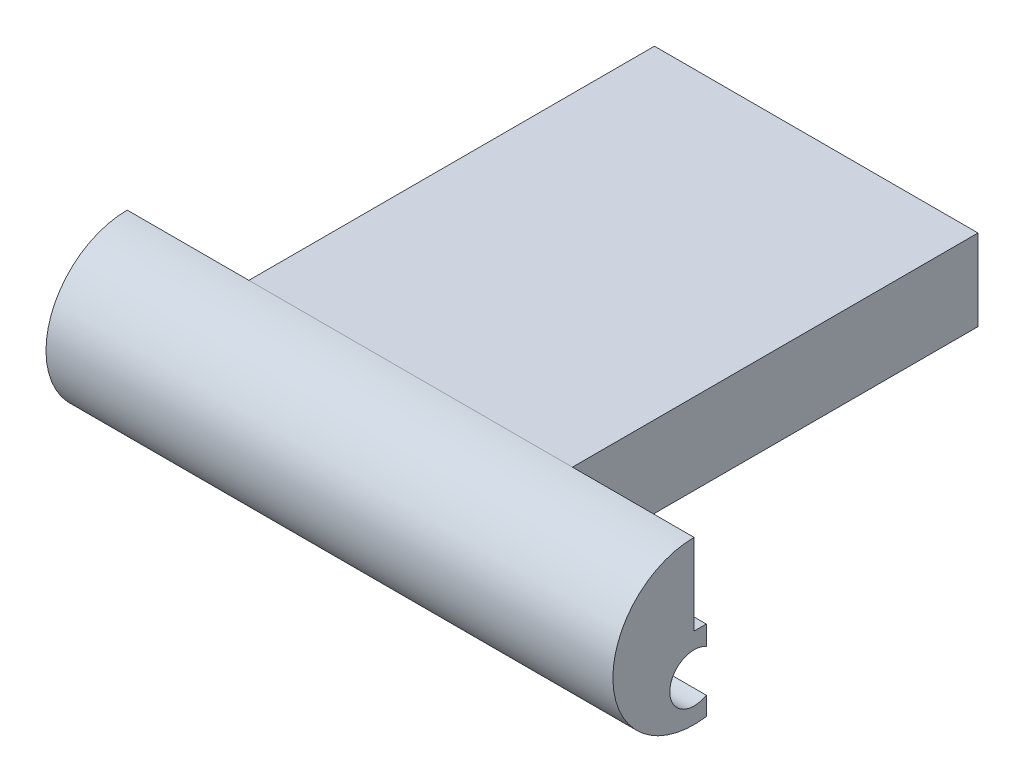
ISO-10303-21;
HEADER;
FILE_DESCRIPTION(('STEP AP214'),'2;1');
FILE_NAME('part.step','',(''),(''),'','','');
FILE_SCHEMA(('AUTOMOTIVE_DESIGN { 1 0 10303 214 1 1 1 1 }'));
ENDSEC;
DATA;
#1=APPLICATION_CONTEXT('core data for automotive mechanical design processes');
#2=APPLICATION_PROTOCOL_DEFINITION('international standard','automotive_design',2000,#1);
#3=PRODUCT_CONTEXT('',#1,'mechanical');
#4=PRODUCT('Part','Part','',(#3));
#5=PRODUCT_RELATED_PRODUCT_CATEGORY('part','',(#4));
#6=PRODUCT_DEFINITION_FORMATION('','',#4);
#7=PRODUCT_DEFINITION_CONTEXT('part definition',#1,'design');
#8=PRODUCT_DEFINITION('design','',#6,#7);
#9=PRODUCT_DEFINITION_SHAPE('','',#8);
#10=(LENGTH_UNIT() NAMED_UNIT(*) SI_UNIT(.MILLI.,.METRE.));
#11=(NAMED_UNIT(*) PLANE_ANGLE_UNIT() SI_UNIT($,.RADIAN.));
#12=(NAMED_UNIT(*) SI_UNIT($,.STERADIAN.) SOLID_ANGLE_UNIT());
#13=UNCERTAINTY_MEASURE_WITH_UNIT(LENGTH_MEASURE(1.E-05),#10,'distance_accuracy_value','');
#14=(GEOMETRIC_REPRESENTATION_CONTEXT(3) GLOBAL_UNCERTAINTY_ASSIGNED_CONTEXT((#13)) GLOBAL_UNIT_ASSIGNED_CONTEXT((#10,
#11,#12)) REPRESENTATION_CONTEXT('',''));
#15=CARTESIAN_POINT('',(0.,0.,0.));
#16=DIRECTION('',(0.,0.,1.));
#17=DIRECTION('',(1.,0.,0.));
#18=AXIS2_PLACEMENT_3D('',#15,#16,#17);
#19=CARTESIAN_POINT('',(-223.899622641509,176.581886792453,500.));
#20=DIRECTION('',(1.,0.,0.));
#21=DIRECTION('',(0.,0.,-1.));
#22=AXIS2_PLACEMENT_3D('',#19,#20,#21);
#23=PLANE('',#22);
#24=DIRECTION('',(0.,-1.,0.));
#25=VECTOR('',#24,1.);
#26=CARTESIAN_POINT('',(-223.899622641509,176.581886792453,0.));
#27=LINE('',#26,#25);
#28=CARTESIAN_POINT('',(-223.899622641509,276.581886792453,0.));
#29=VERTEX_POINT('',#28);
#30=CARTESIAN_POINT('',(-223.899622641509,176.581886792453,0.));
#31=VERTEX_POINT('',#30);
#32=EDGE_CURVE('E177',#29,#31,#27,.T.);
#33=ORIENTED_EDGE('',*,*,#32,.T.);
#34=DIRECTION('',(0.,0.,-1.));
#35=VECTOR('',#34,1.);
#36=CARTESIAN_POINT('',(-223.899622641509,176.581886792453,500.));
#37=LINE('',#36,#35);
#38=CARTESIAN_POINT('',(-223.899622641509,176.581886792453,485.));
#39=VERTEX_POINT('',#38);
#40=EDGE_CURVE('E46',#39,#31,#37,.T.);
#41=ORIENTED_EDGE('',*,*,#40,.F.);
#42=CARTESIAN_POINT('',(-223.899622641509,176.581886792453,500.));
#43=VERTEX_POINT('',#42);
#44=EDGE_CURVE('E11',#43,#39,#37,.T.);
#45=ORIENTED_EDGE('',*,*,#44,.F.);
#46=DIRECTION('',(0.,-1.,0.));
#47=VECTOR('',#46,1.);
#48=CARTESIAN_POINT('',(-223.899622641509,176.581886792453,500.));
#49=LINE('',#48,#47);
#50=CARTESIAN_POINT('',(-223.899622641509,276.581886792453,500.));
#51=VERTEX_POINT('',#50);
#52=EDGE_CURVE('E188',#51,#43,#49,.T.);
#53=ORIENTED_EDGE('',*,*,#52,.F.);
#54=DIRECTION('',(0.,0.,-1.));
#55=VECTOR('',#54,1.);
#56=CARTESIAN_POINT('',(-223.899622641509,276.581886792453,500.));
#57=LINE('',#56,#55);
#58=EDGE_CURVE('E195',#51,#29,#57,.T.);
#59=ORIENTED_EDGE('',*,*,#58,.T.);
#60=EDGE_LOOP('',(#33,#41,#45,#53,#59));
#61=FACE_BOUND('',#60,.T.);
#62=ADVANCED_FACE('F39',(#61),#23,.F.);
#63=CARTESIAN_POINT('',(174.980377358491,176.581886792453,500.));
#64=DIRECTION('',(0.,1.,0.));
#65=DIRECTION('',(-1.,0.,0.));
#66=AXIS2_PLACEMENT_3D('',#63,#64,#65);
#67=PLANE('',#66);
#68=DIRECTION('',(0.,0.,-1.));
#69=VECTOR('',#68,1.);
#70=CARTESIAN_POINT('',(174.980377358491,176.581886792453,500.));
#71=LINE('',#70,#69);
#72=CARTESIAN_POINT('',(174.980377358491,176.581886792453,485.));
#73=VERTEX_POINT('',#72);
#74=CARTESIAN_POINT('',(174.980377358491,176.581886792453,0.));
#75=VERTEX_POINT('',#74);
#76=EDGE_CURVE('E58',#73,#75,#71,.T.);
#77=ORIENTED_EDGE('',*,*,#76,.F.);
#78=DIRECTION('',(-1.,0.,0.));
#79=VECTOR('',#78,1.);
#80=CARTESIAN_POINT('',(324.980377358491,176.581886792453,485.));
#81=LINE('',#80,#79);
#82=EDGE_CURVE('E53',#73,#39,#81,.T.);
#83=ORIENTED_EDGE('',*,*,#82,.T.);
#84=ORIENTED_EDGE('',*,*,#40,.T.);
#85=DIRECTION('',(1.,0.,0.));
#86=VECTOR('',#85,1.);
#87=CARTESIAN_POINT('',(174.980377358491,176.581886792453,0.));
#88=LINE('',#87,#86);
#89=EDGE_CURVE('E198',#31,#75,#88,.T.);
#90=ORIENTED_EDGE('',*,*,#89,.T.);
#91=EDGE_LOOP('',(#77,#83,#84,#90));
#92=FACE_BOUND('',#91,.T.);
#93=ADVANCED_FACE('F213',(#92),#67,.F.);
#94=CARTESIAN_POINT('',(174.980377358491,176.581886792453,500.));
#95=DIRECTION('',(-1.,0.,0.));
#96=DIRECTION('',(0.,0.,1.));
#97=AXIS2_PLACEMENT_3D('',#94,#95,#96);
#98=PLANE('',#97);
#99=DIRECTION('',(0.,1.,0.));
#100=VECTOR('',#99,1.);
#101=CARTESIAN_POINT('',(174.980377358491,176.581886792453,0.));
#102=LINE('',#101,#100);
#103=CARTESIAN_POINT('',(174.980377358491,276.581886792453,0.));
#104=VERTEX_POINT('',#103);
#105=EDGE_CURVE('E200',#75,#104,#102,.T.);
#106=ORIENTED_EDGE('',*,*,#105,.T.);
#107=DIRECTION('',(0.,0.,-1.));
#108=VECTOR('',#107,1.);
#109=CARTESIAN_POINT('',(174.980377358491,276.581886792453,500.));
#110=LINE('',#109,#108);
#111=CARTESIAN_POINT('',(174.980377358491,276.581886792453,500.));
#112=VERTEX_POINT('',#111);
#113=EDGE_CURVE('E205',#112,#104,#110,.T.);
#114=ORIENTED_EDGE('',*,*,#113,.F.);
#115=DIRECTION('',(0.,1.,0.));
#116=VECTOR('',#115,1.);
#117=CARTESIAN_POINT('',(174.980377358491,176.581886792453,500.));
#118=LINE('',#117,#116);
#119=CARTESIAN_POINT('',(174.980377358491,176.581886792453,500.));
#120=VERTEX_POINT('',#119);
#121=EDGE_CURVE('E126',#120,#112,#118,.T.);
#122=ORIENTED_EDGE('',*,*,#121,.F.);
#123=EDGE_CURVE('E207',#120,#73,#71,.T.);
#124=ORIENTED_EDGE('',*,*,#123,.T.);
#125=ORIENTED_EDGE('',*,*,#76,.T.);
#126=EDGE_LOOP('',(#106,#114,#122,#124,#125));
#127=FACE_BOUND('',#126,.T.);
#128=ADVANCED_FACE('F210',(#127),#98,.F.);
#129=CARTESIAN_POINT('',(174.980377358491,276.581886792453,500.));
#130=DIRECTION('',(0.,-1.,0.));
#131=DIRECTION('',(0.,0.,-1.));
#132=AXIS2_PLACEMENT_3D('',#129,#130,#131);
#133=PLANE('',#132);
#134=DIRECTION('',(-1.,0.,0.));
#135=VECTOR('',#134,1.);
#136=CARTESIAN_POINT('',(174.980377358491,276.581886792453,0.));
#137=LINE('',#136,#135);
#138=EDGE_CURVE('E191',#104,#29,#137,.T.);
#139=ORIENTED_EDGE('',*,*,#138,.T.);
#140=ORIENTED_EDGE('',*,*,#58,.F.);
#141=DIRECTION('',(-1.,0.,0.));
#142=VECTOR('',#141,1.);
#143=CARTESIAN_POINT('',(174.980377358491,276.581886792453,500.));
#144=LINE('',#143,#142);
#145=EDGE_CURVE('E193',#112,#51,#144,.T.);
#146=ORIENTED_EDGE('',*,*,#145,.F.);
#147=ORIENTED_EDGE('',*,*,#113,.T.);
#148=EDGE_LOOP('',(#139,#140,#146,#147));
#149=FACE_BOUND('',#148,.T.);
#150=ADVANCED_FACE('F220',(#149),#133,.F.);
#151=CARTESIAN_POINT('',(0.,0.,0.));
#152=DIRECTION('',(0.,0.,1.));
#153=DIRECTION('',(1.,0.,0.));
#154=AXIS2_PLACEMENT_3D('',#151,#152,#153);
#155=PLANE('',#154);
#156=ORIENTED_EDGE('',*,*,#32,.F.);
#157=ORIENTED_EDGE('',*,*,#138,.F.);
#158=ORIENTED_EDGE('',*,*,#105,.F.);
#159=ORIENTED_EDGE('',*,*,#89,.F.);
#160=EDGE_LOOP('',(#156,#157,#158,#159));
#161=FACE_BOUND('',#160,.T.);
#162=ADVANCED_FACE('F217',(#161),#155,.F.);
#163=CARTESIAN_POINT('',(324.980377358491,276.581886792453,500.));
#164=DIRECTION('',(0.,0.,-1.));
#165=DIRECTION('',(-1.,0.,0.));
#166=AXIS2_PLACEMENT_3D('',#163,#164,#165);
#167=PLANE('',#166);
#168=ORIENTED_EDGE('',*,*,#52,.T.);
#169=DIRECTION('',(-1.,0.,0.));
#170=VECTOR('',#169,1.);
#171=CARTESIAN_POINT('',(324.980377358491,176.581886792453,500.));
#172=LINE('',#171,#170);
#173=CARTESIAN_POINT('',(-373.899622641509,176.581886792453,500.));
#174=VERTEX_POINT('',#173);
#175=EDGE_CURVE('E130',#43,#174,#172,.T.);
#176=ORIENTED_EDGE('',*,*,#175,.T.);
#177=DIRECTION('',(0.,-1.,0.));
#178=VECTOR('',#177,1.);
#179=CARTESIAN_POINT('',(-373.899622641509,276.581886792453,500.));
#180=LINE('',#179,#178);
#181=CARTESIAN_POINT('',(-373.899622641509,276.581886792453,500.));
#182=VERTEX_POINT('',#181);
#183=EDGE_CURVE('E165',#182,#174,#180,.T.);
#184=ORIENTED_EDGE('',*,*,#183,.F.);
#185=DIRECTION('',(-1.,0.,0.));
#186=VECTOR('',#185,1.);
#187=CARTESIAN_POINT('',(324.980377358491,276.581886792453,500.));
#188=LINE('',#187,#186);
#189=EDGE_CURVE('E131',#51,#182,#188,.T.);
#190=ORIENTED_EDGE('',*,*,#189,.F.);
#191=EDGE_LOOP('',(#168,#176,#184,#190));
#192=FACE_BOUND('',#191,.T.);
#193=ADVANCED_FACE('F226',(#192),#167,.T.);
#194=ORIENTED_EDGE('',*,*,#121,.T.);
#195=CARTESIAN_POINT('',(324.980377358491,276.581886792453,500.));
#196=VERTEX_POINT('',#195);
#197=EDGE_CURVE('E121',#196,#112,#188,.T.);
#198=ORIENTED_EDGE('',*,*,#197,.F.);
#199=DIRECTION('',(0.,-1.,0.));
#200=VECTOR('',#199,1.);
#201=CARTESIAN_POINT('',(324.980377358491,276.581886792453,500.));
#202=LINE('',#201,#200);
#203=CARTESIAN_POINT('',(324.980377358491,176.581886792453,500.));
#204=VERTEX_POINT('',#203);
#205=EDGE_CURVE('E125',#196,#204,#202,.T.);
#206=ORIENTED_EDGE('',*,*,#205,.T.);
#207=EDGE_CURVE('E186',#204,#120,#172,.T.);
#208=ORIENTED_EDGE('',*,*,#207,.T.);
#209=EDGE_LOOP('',(#194,#198,#206,#208));
#210=FACE_BOUND('',#209,.T.);
#211=ADVANCED_FACE('F123',(#210),#167,.T.);
#212=CARTESIAN_POINT('',(324.980377358491,176.581886792453,500.));
#213=DIRECTION('',(0.,1.,0.));
#214=DIRECTION('',(0.,0.,1.));
#215=AXIS2_PLACEMENT_3D('',#212,#213,#214);
#216=PLANE('',#215);
#217=ORIENTED_EDGE('',*,*,#44,.T.);
#218=CARTESIAN_POINT('',(-373.899622641509,176.581886792453,485.));
#219=VERTEX_POINT('',#218);
#220=EDGE_CURVE('E185',#39,#219,#81,.T.);
#221=ORIENTED_EDGE('',*,*,#220,.T.);
#222=DIRECTION('',(0.,0.,-1.));
#223=VECTOR('',#222,1.);
#224=CARTESIAN_POINT('',(-373.899622641509,176.581886792453,500.));
#225=LINE('',#224,#223);
#226=EDGE_CURVE('E168',#174,#219,#225,.T.);
#227=ORIENTED_EDGE('',*,*,#226,.F.);
#228=ORIENTED_EDGE('',*,*,#175,.F.);
#229=EDGE_LOOP('',(#217,#221,#227,#228));
#230=FACE_BOUND('',#229,.T.);
#231=ADVANCED_FACE('F230',(#230),#216,.T.);
#232=ORIENTED_EDGE('',*,*,#123,.F.);
#233=ORIENTED_EDGE('',*,*,#207,.F.);
#234=DIRECTION('',(0.,0.,-1.));
#235=VECTOR('',#234,1.);
#236=CARTESIAN_POINT('',(324.980377358491,176.581886792453,500.));
#237=LINE('',#236,#235);
#238=CARTESIAN_POINT('',(324.980377358491,176.581886792453,485.));
#239=VERTEX_POINT('',#238);
#240=EDGE_CURVE('E142',#204,#239,#237,.T.);
#241=ORIENTED_EDGE('',*,*,#240,.T.);
#242=EDGE_CURVE('E182',#239,#73,#81,.T.);
#243=ORIENTED_EDGE('',*,*,#242,.T.);
#244=EDGE_LOOP('',(#232,#233,#241,#243));
#245=FACE_BOUND('',#244,.T.);
#246=ADVANCED_FACE('F244',(#245),#216,.T.);
#247=CARTESIAN_POINT('',(324.980377358491,176.581960729146,500.121603179235));
#248=DIRECTION('',(-1.,0.,0.));
#249=DIRECTION('',(0.,0.,1.));
#250=AXIS2_PLACEMENT_3D('',#247,#248,#249);
#251=CYLINDRICAL_SURFACE('',#250,100.);
#252=CARTESIAN_POINT('',(-373.899622641509,176.581960729146,500.121603179235));
#253=DIRECTION('',(-1.,0.,0.));
#254=DIRECTION('',(0.,0.,1.));
#255=AXIS2_PLACEMENT_3D('',#252,#253,#254);
#256=CIRCLE('',#255,100.);
#257=CARTESIAN_POINT('',(-373.899622641509,77.7318867924529,485.));
#258=VERTEX_POINT('',#257);
#259=EDGE_CURVE('E162',#258,#182,#256,.T.);
#260=ORIENTED_EDGE('',*,*,#259,.F.);
#261=DIRECTION('',(-1.,0.,0.));
#262=VECTOR('',#261,1.);
#263=CARTESIAN_POINT('',(324.980377358491,77.7318867924529,485.));
#264=LINE('',#263,#262);
#265=CARTESIAN_POINT('',(324.980377358491,77.7318867924529,485.));
#266=VERTEX_POINT('',#265);
#267=EDGE_CURVE('E146',#266,#258,#264,.T.);
#268=ORIENTED_EDGE('',*,*,#267,.F.);
#269=CARTESIAN_POINT('',(324.980377358491,176.581960729146,500.121603179235));
#270=DIRECTION('',(-1.,0.,0.));
#271=DIRECTION('',(0.,0.,1.));
#272=AXIS2_PLACEMENT_3D('',#269,#270,#271);
#273=CIRCLE('',#272,100.);
#274=EDGE_CURVE('E138',#266,#196,#273,.T.);
#275=ORIENTED_EDGE('',*,*,#274,.T.);
#276=ORIENTED_EDGE('',*,*,#197,.T.);
#277=ORIENTED_EDGE('',*,*,#145,.T.);
#278=ORIENTED_EDGE('',*,*,#189,.T.);
#279=EDGE_LOOP('',(#260,#268,#275,#276,#277,#278));
#280=FACE_BOUND('',#279,.T.);
#281=ADVANCED_FACE('F145',(#280),#251,.T.);
#282=CARTESIAN_POINT('',(324.980377358491,77.7318867924529,485.));
#283=DIRECTION('',(0.,0.,-1.));
#284=DIRECTION('',(-1.,0.,0.));
#285=AXIS2_PLACEMENT_3D('',#282,#283,#284);
#286=PLANE('',#285);
#287=DIRECTION('',(0.,-1.,0.));
#288=VECTOR('',#287,1.);
#289=CARTESIAN_POINT('',(-373.899622641509,77.7318867924529,485.));
#290=LINE('',#289,#288);
#291=CARTESIAN_POINT('',(-373.899622641509,100.621886792453,485.));
#292=VERTEX_POINT('',#291);
#293=EDGE_CURVE('E147',#292,#258,#290,.T.);
#294=ORIENTED_EDGE('',*,*,#293,.F.);
#295=DIRECTION('',(-1.,0.,0.));
#296=VECTOR('',#295,1.);
#297=CARTESIAN_POINT('',(324.980377358491,100.621886792453,485.));
#298=LINE('',#297,#296);
#299=CARTESIAN_POINT('',(324.980377358491,100.621886792453,485.));
#300=VERTEX_POINT('',#299);
#301=EDGE_CURVE('E178',#300,#292,#298,.T.);
#302=ORIENTED_EDGE('',*,*,#301,.F.);
#303=DIRECTION('',(0.,-1.,0.));
#304=VECTOR('',#303,1.);
#305=CARTESIAN_POINT('',(324.980377358491,77.7318867924529,485.));
#306=LINE('',#305,#304);
#307=EDGE_CURVE('E160',#300,#266,#306,.T.);
#308=ORIENTED_EDGE('',*,*,#307,.T.);
#309=ORIENTED_EDGE('',*,*,#267,.T.);
#310=EDGE_LOOP('',(#294,#302,#308,#309));
#311=FACE_BOUND('',#310,.T.);
#312=ADVANCED_FACE('F238',(#311),#286,.T.);
#313=CARTESIAN_POINT('',(324.980377358491,126.601886792453,500.001319941925));
#314=DIRECTION('',(-1.,0.,0.));
#315=DIRECTION('',(0.,0.,1.));
#316=AXIS2_PLACEMENT_3D('',#313,#314,#315);
#317=CYLINDRICAL_SURFACE('',#316,30.);
#318=CARTESIAN_POINT('',(-373.899622641509,126.601886792453,500.001319941925));
#319=DIRECTION('',(1.,0.,0.));
#320=DIRECTION('',(0.,0.,1.));
#321=AXIS2_PLACEMENT_3D('',#318,#319,#320);
#322=CIRCLE('',#321,30.);
#323=CARTESIAN_POINT('',(-373.899622641509,152.581886792453,485.));
#324=VERTEX_POINT('',#323);
#325=EDGE_CURVE('E150',#324,#292,#322,.T.);
#326=ORIENTED_EDGE('',*,*,#325,.F.);
#327=DIRECTION('',(-1.,0.,0.));
#328=VECTOR('',#327,1.);
#329=CARTESIAN_POINT('',(324.980377358491,152.581886792453,485.));
#330=LINE('',#329,#328);
#331=CARTESIAN_POINT('',(324.980377358491,152.581886792453,485.));
#332=VERTEX_POINT('',#331);
#333=EDGE_CURVE('E180',#332,#324,#330,.T.);
#334=ORIENTED_EDGE('',*,*,#333,.F.);
#335=CARTESIAN_POINT('',(324.980377358491,126.601886792453,500.001319941925));
#336=DIRECTION('',(1.,0.,0.));
#337=DIRECTION('',(0.,0.,1.));
#338=AXIS2_PLACEMENT_3D('',#335,#336,#337);
#339=CIRCLE('',#338,30.);
#340=EDGE_CURVE('E157',#332,#300,#339,.T.);
#341=ORIENTED_EDGE('',*,*,#340,.T.);
#342=ORIENTED_EDGE('',*,*,#301,.T.);
#343=EDGE_LOOP('',(#326,#334,#341,#342));
#344=FACE_BOUND('',#343,.T.);
#345=ADVANCED_FACE('F295',(#344),#317,.F.);
#346=CARTESIAN_POINT('',(324.980377358491,176.581886792453,485.));
#347=DIRECTION('',(0.,0.,-1.));
#348=DIRECTION('',(-1.,0.,0.));
#349=AXIS2_PLACEMENT_3D('',#346,#347,#348);
#350=PLANE('',#349);
#351=DIRECTION('',(0.,-1.,0.));
#352=VECTOR('',#351,1.);
#353=CARTESIAN_POINT('',(-373.899622641509,176.581886792453,485.));
#354=LINE('',#353,#352);
#355=EDGE_CURVE('E171',#219,#324,#354,.T.);
#356=ORIENTED_EDGE('',*,*,#355,.F.);
#357=ORIENTED_EDGE('',*,*,#220,.F.);
#358=ORIENTED_EDGE('',*,*,#82,.F.);
#359=ORIENTED_EDGE('',*,*,#242,.F.);
#360=DIRECTION('',(0.,-1.,0.));
#361=VECTOR('',#360,1.);
#362=CARTESIAN_POINT('',(324.980377358491,176.581886792453,485.));
#363=LINE('',#362,#361);
#364=EDGE_CURVE('E154',#239,#332,#363,.T.);
#365=ORIENTED_EDGE('',*,*,#364,.T.);
#366=ORIENTED_EDGE('',*,*,#333,.T.);
#367=EDGE_LOOP('',(#356,#357,#358,#359,#365,#366));
#368=FACE_BOUND('',#367,.T.);
#369=ADVANCED_FACE('F242',(#368),#350,.T.);
#370=CARTESIAN_POINT('',(324.980377358491,176.581960729146,500.121603179235));
#371=DIRECTION('',(-1.,0.,0.));
#372=DIRECTION('',(0.,0.,1.));
#373=AXIS2_PLACEMENT_3D('',#370,#371,#372);
#374=PLANE('',#373);
#375=ORIENTED_EDGE('',*,*,#274,.F.);
#376=ORIENTED_EDGE('',*,*,#307,.F.);
#377=ORIENTED_EDGE('',*,*,#340,.F.);
#378=ORIENTED_EDGE('',*,*,#364,.F.);
#379=ORIENTED_EDGE('',*,*,#240,.F.);
#380=ORIENTED_EDGE('',*,*,#205,.F.);
#381=EDGE_LOOP('',(#375,#376,#377,#378,#379,#380));
#382=FACE_BOUND('',#381,.T.);
#383=ADVANCED_FACE('F136',(#382),#374,.F.);
#384=CARTESIAN_POINT('',(-373.899622641509,176.581960729146,500.121603179235));
#385=DIRECTION('',(-1.,0.,0.));
#386=DIRECTION('',(0.,0.,1.));
#387=AXIS2_PLACEMENT_3D('',#384,#385,#386);
#388=PLANE('',#387);
#389=ORIENTED_EDGE('',*,*,#259,.T.);
#390=ORIENTED_EDGE('',*,*,#183,.T.);
#391=ORIENTED_EDGE('',*,*,#226,.T.);
#392=ORIENTED_EDGE('',*,*,#355,.T.);
#393=ORIENTED_EDGE('',*,*,#325,.T.);
#394=ORIENTED_EDGE('',*,*,#293,.T.);
#395=EDGE_LOOP('',(#389,#390,#391,#392,#393,#394));
#396=FACE_BOUND('',#395,.T.);
#397=ADVANCED_FACE('F234',(#396),#388,.T.);
#398=CLOSED_SHELL('',(#62,#93,#128,#150,#162,#193,#211,#231,#246,#281,#312,#345,#369,#383,#397));
#399=MANIFOLD_SOLID_BREP('B2',#398);
#400=ADVANCED_BREP_SHAPE_REPRESENTATION('',(#18,#399),#14);
#401=SHAPE_DEFINITION_REPRESENTATION(#9,#400);
ENDSEC;
END-ISO-10303-21;
